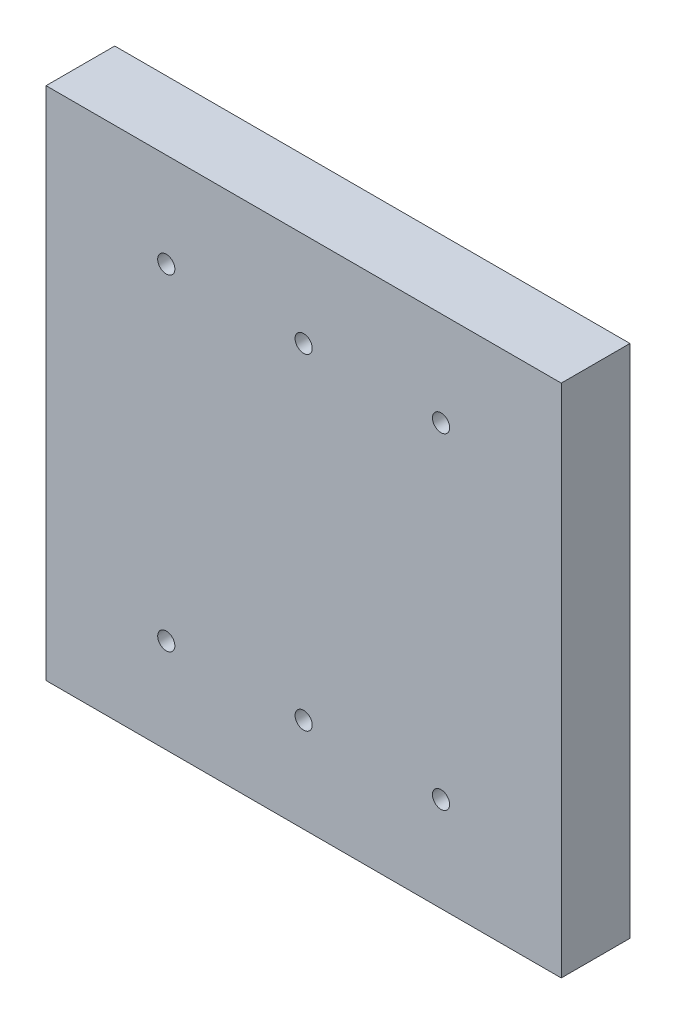
ISO-10303-21;
HEADER;
FILE_DESCRIPTION(('STEP AP214'),'2;1');
FILE_NAME('part.step','',(''),(''),'','','');
FILE_SCHEMA(('AUTOMOTIVE_DESIGN { 1 0 10303 214 1 1 1 1 }'));
ENDSEC;
DATA;
#1=APPLICATION_CONTEXT('core data for automotive mechanical design processes');
#2=APPLICATION_PROTOCOL_DEFINITION('international standard','automotive_design',2000,#1);
#3=PRODUCT_CONTEXT('',#1,'mechanical');
#4=PRODUCT('Part','Part','',(#3));
#5=PRODUCT_RELATED_PRODUCT_CATEGORY('part','',(#4));
#6=PRODUCT_DEFINITION_FORMATION('','',#4);
#7=PRODUCT_DEFINITION_CONTEXT('part definition',#1,'design');
#8=PRODUCT_DEFINITION('design','',#6,#7);
#9=PRODUCT_DEFINITION_SHAPE('','',#8);
#10=(LENGTH_UNIT() NAMED_UNIT(*) SI_UNIT(.MILLI.,.METRE.));
#11=(NAMED_UNIT(*) PLANE_ANGLE_UNIT() SI_UNIT($,.RADIAN.));
#12=(NAMED_UNIT(*) SI_UNIT($,.STERADIAN.) SOLID_ANGLE_UNIT());
#13=UNCERTAINTY_MEASURE_WITH_UNIT(LENGTH_MEASURE(1.E-05),#10,'distance_accuracy_value','');
#14=(GEOMETRIC_REPRESENTATION_CONTEXT(3) GLOBAL_UNCERTAINTY_ASSIGNED_CONTEXT((#13)) GLOBAL_UNIT_ASSIGNED_CONTEXT((#10,
#11,#12)) REPRESENTATION_CONTEXT('',''));
#15=CARTESIAN_POINT('',(0.,0.,0.));
#16=DIRECTION('',(0.,0.,1.));
#17=DIRECTION('',(1.,0.,0.));
#18=AXIS2_PLACEMENT_3D('',#15,#16,#17);
#19=CARTESIAN_POINT('',(-150.,-150.,10.));
#20=DIRECTION('',(0.,1.,0.));
#21=DIRECTION('',(0.,0.,1.));
#22=AXIS2_PLACEMENT_3D('',#19,#20,#21);
#23=PLANE('',#22);
#24=DIRECTION('',(0.,0.,-1.));
#25=VECTOR('',#24,1.);
#26=CARTESIAN_POINT('',(-150.,-150.,10.));
#27=LINE('',#26,#25);
#28=CARTESIAN_POINT('',(-150.,-150.,10.));
#29=VERTEX_POINT('',#28);
#30=CARTESIAN_POINT('',(-150.,-150.,-30.));
#31=VERTEX_POINT('',#30);
#32=EDGE_CURVE('E89',#29,#31,#27,.T.);
#33=ORIENTED_EDGE('',*,*,#32,.T.);
#34=DIRECTION('',(1.,0.,0.));
#35=VECTOR('',#34,1.);
#36=CARTESIAN_POINT('',(0.,-150.,-30.));
#37=LINE('',#36,#35);
#38=CARTESIAN_POINT('',(150.,-150.,-30.));
#39=VERTEX_POINT('',#38);
#40=EDGE_CURVE('E145',#31,#39,#37,.T.);
#41=ORIENTED_EDGE('',*,*,#40,.T.);
#42=DIRECTION('',(0.,0.,-1.));
#43=VECTOR('',#42,1.);
#44=CARTESIAN_POINT('',(150.,-150.,10.));
#45=LINE('',#44,#43);
#46=CARTESIAN_POINT('',(150.,-150.,10.));
#47=VERTEX_POINT('',#46);
#48=EDGE_CURVE('E12',#47,#39,#45,.T.);
#49=ORIENTED_EDGE('',*,*,#48,.F.);
#50=DIRECTION('',(1.,0.,0.));
#51=VECTOR('',#50,1.);
#52=CARTESIAN_POINT('',(-150.,-150.,10.));
#53=LINE('',#52,#51);
#54=EDGE_CURVE('E181',#29,#47,#53,.T.);
#55=ORIENTED_EDGE('',*,*,#54,.F.);
#56=EDGE_LOOP('',(#33,#41,#49,#55));
#57=FACE_BOUND('',#56,.T.);
#58=ADVANCED_FACE('F65',(#57),#23,.F.);
#59=CARTESIAN_POINT('',(150.,-150.,10.));
#60=DIRECTION('',(-1.,0.,0.));
#61=DIRECTION('',(0.,-1.,0.));
#62=AXIS2_PLACEMENT_3D('',#59,#60,#61);
#63=PLANE('',#62);
#64=ORIENTED_EDGE('',*,*,#48,.T.);
#65=DIRECTION('',(0.,1.,0.));
#66=VECTOR('',#65,1.);
#67=CARTESIAN_POINT('',(150.,0.,-30.));
#68=LINE('',#67,#66);
#69=CARTESIAN_POINT('',(150.,150.,-30.));
#70=VERTEX_POINT('',#69);
#71=EDGE_CURVE('E134',#39,#70,#68,.T.);
#72=ORIENTED_EDGE('',*,*,#71,.T.);
#73=DIRECTION('',(0.,0.,-1.));
#74=VECTOR('',#73,1.);
#75=CARTESIAN_POINT('',(150.,150.,10.));
#76=LINE('',#75,#74);
#77=CARTESIAN_POINT('',(150.,150.,10.));
#78=VERTEX_POINT('',#77);
#79=EDGE_CURVE('E73',#78,#70,#76,.T.);
#80=ORIENTED_EDGE('',*,*,#79,.F.);
#81=DIRECTION('',(0.,1.,0.));
#82=VECTOR('',#81,1.);
#83=CARTESIAN_POINT('',(150.,-150.,10.));
#84=LINE('',#83,#82);
#85=EDGE_CURVE('E135',#47,#78,#84,.T.);
#86=ORIENTED_EDGE('',*,*,#85,.F.);
#87=EDGE_LOOP('',(#64,#72,#80,#86));
#88=FACE_BOUND('',#87,.T.);
#89=ADVANCED_FACE('F132',(#88),#63,.F.);
#90=CARTESIAN_POINT('',(-150.,150.,10.));
#91=DIRECTION('',(0.,1.,0.));
#92=DIRECTION('',(0.,0.,1.));
#93=AXIS2_PLACEMENT_3D('',#90,#91,#92);
#94=PLANE('',#93);
#95=ORIENTED_EDGE('',*,*,#79,.T.);
#96=DIRECTION('',(1.,0.,0.));
#97=VECTOR('',#96,1.);
#98=CARTESIAN_POINT('',(0.,150.,-30.));
#99=LINE('',#98,#97);
#100=CARTESIAN_POINT('',(-150.,150.,-30.));
#101=VERTEX_POINT('',#100);
#102=EDGE_CURVE('E147',#101,#70,#99,.T.);
#103=ORIENTED_EDGE('',*,*,#102,.F.);
#104=DIRECTION('',(0.,0.,-1.));
#105=VECTOR('',#104,1.);
#106=CARTESIAN_POINT('',(-150.,150.,10.));
#107=LINE('',#106,#105);
#108=CARTESIAN_POINT('',(-150.,150.,10.));
#109=VERTEX_POINT('',#108);
#110=EDGE_CURVE('E195',#109,#101,#107,.T.);
#111=ORIENTED_EDGE('',*,*,#110,.F.);
#112=DIRECTION('',(1.,0.,0.));
#113=VECTOR('',#112,1.);
#114=CARTESIAN_POINT('',(-150.,150.,10.));
#115=LINE('',#114,#113);
#116=EDGE_CURVE('E189',#109,#78,#115,.T.);
#117=ORIENTED_EDGE('',*,*,#116,.T.);
#118=EDGE_LOOP('',(#95,#103,#111,#117));
#119=FACE_BOUND('',#118,.T.);
#120=ADVANCED_FACE('F235',(#119),#94,.T.);
#121=CARTESIAN_POINT('',(-150.,-150.,10.));
#122=DIRECTION('',(-1.,0.,0.));
#123=DIRECTION('',(0.,0.,1.));
#124=AXIS2_PLACEMENT_3D('',#121,#122,#123);
#125=PLANE('',#124);
#126=ORIENTED_EDGE('',*,*,#110,.T.);
#127=DIRECTION('',(0.,1.,0.));
#128=VECTOR('',#127,1.);
#129=CARTESIAN_POINT('',(-150.,0.,-30.));
#130=LINE('',#129,#128);
#131=EDGE_CURVE('E158',#31,#101,#130,.T.);
#132=ORIENTED_EDGE('',*,*,#131,.F.);
#133=ORIENTED_EDGE('',*,*,#32,.F.);
#134=DIRECTION('',(0.,1.,0.));
#135=VECTOR('',#134,1.);
#136=CARTESIAN_POINT('',(-150.,-150.,10.));
#137=LINE('',#136,#135);
#138=EDGE_CURVE('E192',#29,#109,#137,.T.);
#139=ORIENTED_EDGE('',*,*,#138,.T.);
#140=EDGE_LOOP('',(#126,#132,#133,#139));
#141=FACE_BOUND('',#140,.T.);
#142=ADVANCED_FACE('F239',(#141),#125,.T.);
#143=CARTESIAN_POINT('',(0.,0.,10.));
#144=DIRECTION('',(0.,0.,1.));
#145=DIRECTION('',(1.,0.,0.));
#146=AXIS2_PLACEMENT_3D('',#143,#144,#145);
#147=PLANE('',#146);
#148=CARTESIAN_POINT('',(0.,-94.9999999999998,10.));
#149=DIRECTION('',(0.,0.,1.));
#150=DIRECTION('',(1.,0.,0.));
#151=AXIS2_PLACEMENT_3D('',#148,#149,#150);
#152=CIRCLE('',#151,5.);
#153=CARTESIAN_POINT('',(5.,-94.9999999999998,10.));
#154=VERTEX_POINT('',#153);
#155=EDGE_CURVE('E311',#154,#154,#152,.T.);
#156=ORIENTED_EDGE('',*,*,#155,.F.);
#157=EDGE_LOOP('',(#156));
#158=FACE_BOUND('',#157,.T.);
#159=CARTESIAN_POINT('',(-80.,94.9999999999999,10.));
#160=DIRECTION('',(0.,0.,1.));
#161=DIRECTION('',(1.,0.,0.));
#162=AXIS2_PLACEMENT_3D('',#159,#160,#161);
#163=CIRCLE('',#162,5.00000000000001);
#164=CARTESIAN_POINT('',(-75.,94.9999999999999,10.));
#165=VERTEX_POINT('',#164);
#166=EDGE_CURVE('E309',#165,#165,#163,.T.);
#167=ORIENTED_EDGE('',*,*,#166,.F.);
#168=EDGE_LOOP('',(#167));
#169=FACE_BOUND('',#168,.T.);
#170=CARTESIAN_POINT('',(0.,94.9999999999999,10.));
#171=DIRECTION('',(0.,0.,1.));
#172=DIRECTION('',(1.,0.,0.));
#173=AXIS2_PLACEMENT_3D('',#170,#171,#172);
#174=CIRCLE('',#173,5.);
#175=CARTESIAN_POINT('',(5.00000000000001,94.9999999999999,10.));
#176=VERTEX_POINT('',#175);
#177=EDGE_CURVE('E305',#176,#176,#174,.T.);
#178=ORIENTED_EDGE('',*,*,#177,.F.);
#179=EDGE_LOOP('',(#178));
#180=FACE_BOUND('',#179,.T.);
#181=CARTESIAN_POINT('',(80.,94.9999999999999,10.));
#182=DIRECTION('',(0.,0.,1.));
#183=DIRECTION('',(1.,0.,0.));
#184=AXIS2_PLACEMENT_3D('',#181,#182,#183);
#185=CIRCLE('',#184,5.00000000000001);
#186=CARTESIAN_POINT('',(85.,94.9999999999999,10.));
#187=VERTEX_POINT('',#186);
#188=EDGE_CURVE('E286',#187,#187,#185,.T.);
#189=ORIENTED_EDGE('',*,*,#188,.F.);
#190=EDGE_LOOP('',(#189));
#191=FACE_BOUND('',#190,.T.);
#192=CARTESIAN_POINT('',(-80.,-94.9999999999998,10.));
#193=DIRECTION('',(0.,0.,1.));
#194=DIRECTION('',(1.,0.,0.));
#195=AXIS2_PLACEMENT_3D('',#192,#193,#194);
#196=CIRCLE('',#195,5.00000000000001);
#197=CARTESIAN_POINT('',(-75.,-94.9999999999998,10.));
#198=VERTEX_POINT('',#197);
#199=EDGE_CURVE('E313',#198,#198,#196,.T.);
#200=ORIENTED_EDGE('',*,*,#199,.F.);
#201=EDGE_LOOP('',(#200));
#202=FACE_BOUND('',#201,.T.);
#203=CARTESIAN_POINT('',(80.,-94.9999999999998,10.));
#204=DIRECTION('',(0.,0.,1.));
#205=DIRECTION('',(1.,0.,0.));
#206=AXIS2_PLACEMENT_3D('',#203,#204,#205);
#207=CIRCLE('',#206,5.00000000000001);
#208=CARTESIAN_POINT('',(85.,-94.9999999999998,10.));
#209=VERTEX_POINT('',#208);
#210=EDGE_CURVE('E154',#209,#209,#207,.T.);
#211=ORIENTED_EDGE('',*,*,#210,.F.);
#212=EDGE_LOOP('',(#211));
#213=FACE_BOUND('',#212,.T.);
#214=ORIENTED_EDGE('',*,*,#54,.T.);
#215=ORIENTED_EDGE('',*,*,#85,.T.);
#216=ORIENTED_EDGE('',*,*,#116,.F.);
#217=ORIENTED_EDGE('',*,*,#138,.F.);
#218=EDGE_LOOP('',(#214,#215,#216,#217));
#219=FACE_BOUND('',#218,.T.);
#220=ADVANCED_FACE('F245',(#158,#169,#180,#191,#202,#213,#219),#147,.T.);
#221=CARTESIAN_POINT('',(120.,0.,-30.));
#222=DIRECTION('',(1.,0.,0.));
#223=DIRECTION('',(0.,1.,0.));
#224=AXIS2_PLACEMENT_3D('',#221,#222,#223);
#225=PLANE('',#224);
#226=DIRECTION('',(0.,1.,0.));
#227=VECTOR('',#226,1.);
#228=CARTESIAN_POINT('',(120.,0.,0.));
#229=LINE('',#228,#227);
#230=CARTESIAN_POINT('',(120.,-120.,0.));
#231=VERTEX_POINT('',#230);
#232=CARTESIAN_POINT('',(120.,120.,0.));
#233=VERTEX_POINT('',#232);
#234=EDGE_CURVE('E172',#231,#233,#229,.T.);
#235=ORIENTED_EDGE('',*,*,#234,.T.);
#236=DIRECTION('',(0.,0.,1.));
#237=VECTOR('',#236,1.);
#238=CARTESIAN_POINT('',(120.,120.,-30.));
#239=LINE('',#238,#237);
#240=CARTESIAN_POINT('',(120.,120.,-30.));
#241=VERTEX_POINT('',#240);
#242=EDGE_CURVE('E179',#241,#233,#239,.T.);
#243=ORIENTED_EDGE('',*,*,#242,.F.);
#244=DIRECTION('',(0.,1.,0.));
#245=VECTOR('',#244,1.);
#246=CARTESIAN_POINT('',(120.,0.,-30.));
#247=LINE('',#246,#245);
#248=CARTESIAN_POINT('',(120.,-120.,-30.));
#249=VERTEX_POINT('',#248);
#250=EDGE_CURVE('E160',#249,#241,#247,.T.);
#251=ORIENTED_EDGE('',*,*,#250,.F.);
#252=DIRECTION('',(0.,0.,1.));
#253=VECTOR('',#252,1.);
#254=CARTESIAN_POINT('',(120.,-120.,-30.));
#255=LINE('',#254,#253);
#256=EDGE_CURVE('E171',#249,#231,#255,.T.);
#257=ORIENTED_EDGE('',*,*,#256,.T.);
#258=EDGE_LOOP('',(#235,#243,#251,#257));
#259=FACE_BOUND('',#258,.T.);
#260=ADVANCED_FACE('F251',(#259),#225,.F.);
#261=CARTESIAN_POINT('',(0.,120.,-30.));
#262=DIRECTION('',(0.,1.,0.));
#263=DIRECTION('',(-1.,0.,0.));
#264=AXIS2_PLACEMENT_3D('',#261,#262,#263);
#265=PLANE('',#264);
#266=DIRECTION('',(-1.,0.,0.));
#267=VECTOR('',#266,1.);
#268=CARTESIAN_POINT('',(0.,120.,0.));
#269=LINE('',#268,#267);
#270=CARTESIAN_POINT('',(-120.,120.,0.));
#271=VERTEX_POINT('',#270);
#272=EDGE_CURVE('E149',#233,#271,#269,.T.);
#273=ORIENTED_EDGE('',*,*,#272,.T.);
#274=DIRECTION('',(0.,0.,1.));
#275=VECTOR('',#274,1.);
#276=CARTESIAN_POINT('',(-120.,120.,-30.));
#277=LINE('',#276,#275);
#278=CARTESIAN_POINT('',(-120.,120.,-30.));
#279=VERTEX_POINT('',#278);
#280=EDGE_CURVE('E182',#279,#271,#277,.T.);
#281=ORIENTED_EDGE('',*,*,#280,.F.);
#282=DIRECTION('',(-1.,0.,0.));
#283=VECTOR('',#282,1.);
#284=CARTESIAN_POINT('',(0.,120.,-30.));
#285=LINE('',#284,#283);
#286=EDGE_CURVE('E169',#241,#279,#285,.T.);
#287=ORIENTED_EDGE('',*,*,#286,.F.);
#288=ORIENTED_EDGE('',*,*,#242,.T.);
#289=EDGE_LOOP('',(#273,#281,#287,#288));
#290=FACE_BOUND('',#289,.T.);
#291=ADVANCED_FACE('F255',(#290),#265,.F.);
#292=CARTESIAN_POINT('',(-120.,0.,-30.));
#293=DIRECTION('',(1.,0.,0.));
#294=DIRECTION('',(0.,1.,0.));
#295=AXIS2_PLACEMENT_3D('',#292,#293,#294);
#296=PLANE('',#295);
#297=DIRECTION('',(0.,1.,0.));
#298=VECTOR('',#297,1.);
#299=CARTESIAN_POINT('',(-120.,0.,0.));
#300=LINE('',#299,#298);
#301=CARTESIAN_POINT('',(-120.,-120.,0.));
#302=VERTEX_POINT('',#301);
#303=EDGE_CURVE('E81',#302,#271,#300,.T.);
#304=ORIENTED_EDGE('',*,*,#303,.F.);
#305=DIRECTION('',(0.,0.,1.));
#306=VECTOR('',#305,1.);
#307=CARTESIAN_POINT('',(-120.,-120.,-30.));
#308=LINE('',#307,#306);
#309=CARTESIAN_POINT('',(-120.,-120.,-30.));
#310=VERTEX_POINT('',#309);
#311=EDGE_CURVE('E184',#310,#302,#308,.T.);
#312=ORIENTED_EDGE('',*,*,#311,.F.);
#313=DIRECTION('',(0.,1.,0.));
#314=VECTOR('',#313,1.);
#315=CARTESIAN_POINT('',(-120.,0.,-30.));
#316=LINE('',#315,#314);
#317=EDGE_CURVE('E166',#310,#279,#316,.T.);
#318=ORIENTED_EDGE('',*,*,#317,.T.);
#319=ORIENTED_EDGE('',*,*,#280,.T.);
#320=EDGE_LOOP('',(#304,#312,#318,#319));
#321=FACE_BOUND('',#320,.T.);
#322=ADVANCED_FACE('F260',(#321),#296,.T.);
#323=CARTESIAN_POINT('',(0.,-120.,-30.));
#324=DIRECTION('',(0.,1.,0.));
#325=DIRECTION('',(0.,0.,1.));
#326=AXIS2_PLACEMENT_3D('',#323,#324,#325);
#327=PLANE('',#326);
#328=DIRECTION('',(-1.,0.,0.));
#329=VECTOR('',#328,1.);
#330=CARTESIAN_POINT('',(0.,-120.,0.));
#331=LINE('',#330,#329);
#332=EDGE_CURVE('E175',#231,#302,#331,.T.);
#333=ORIENTED_EDGE('',*,*,#332,.F.);
#334=ORIENTED_EDGE('',*,*,#256,.F.);
#335=DIRECTION('',(-1.,0.,0.));
#336=VECTOR('',#335,1.);
#337=CARTESIAN_POINT('',(0.,-120.,-30.));
#338=LINE('',#337,#336);
#339=EDGE_CURVE('E163',#249,#310,#338,.T.);
#340=ORIENTED_EDGE('',*,*,#339,.T.);
#341=ORIENTED_EDGE('',*,*,#311,.T.);
#342=EDGE_LOOP('',(#333,#334,#340,#341));
#343=FACE_BOUND('',#342,.T.);
#344=ADVANCED_FACE('F257',(#343),#327,.T.);
#345=CARTESIAN_POINT('',(0.,0.,-30.));
#346=DIRECTION('',(0.,0.,1.));
#347=DIRECTION('',(1.,0.,0.));
#348=AXIS2_PLACEMENT_3D('',#345,#346,#347);
#349=PLANE('',#348);
#350=ORIENTED_EDGE('',*,*,#40,.F.);
#351=ORIENTED_EDGE('',*,*,#131,.T.);
#352=ORIENTED_EDGE('',*,*,#102,.T.);
#353=ORIENTED_EDGE('',*,*,#71,.F.);
#354=EDGE_LOOP('',(#350,#351,#352,#353));
#355=FACE_BOUND('',#354,.T.);
#356=ORIENTED_EDGE('',*,*,#250,.T.);
#357=ORIENTED_EDGE('',*,*,#286,.T.);
#358=ORIENTED_EDGE('',*,*,#317,.F.);
#359=ORIENTED_EDGE('',*,*,#339,.F.);
#360=EDGE_LOOP('',(#356,#357,#358,#359));
#361=FACE_BOUND('',#360,.T.);
#362=ADVANCED_FACE('F142',(#355,#361),#349,.F.);
#363=CARTESIAN_POINT('',(0.,0.,0.));
#364=DIRECTION('',(0.,0.,1.));
#365=DIRECTION('',(1.,0.,0.));
#366=AXIS2_PLACEMENT_3D('',#363,#364,#365);
#367=PLANE('',#366);
#368=CARTESIAN_POINT('',(0.,-94.9999999999998,0.));
#369=DIRECTION('',(0.,0.,1.));
#370=DIRECTION('',(1.,0.,0.));
#371=AXIS2_PLACEMENT_3D('',#368,#369,#370);
#372=CIRCLE('',#371,5.);
#373=CARTESIAN_POINT('',(5.,-94.9999999999998,0.));
#374=VERTEX_POINT('',#373);
#375=EDGE_CURVE('E68',#374,#374,#372,.T.);
#376=ORIENTED_EDGE('',*,*,#375,.T.);
#377=EDGE_LOOP('',(#376));
#378=FACE_BOUND('',#377,.T.);
#379=CARTESIAN_POINT('',(-80.,94.9999999999999,0.));
#380=DIRECTION('',(0.,0.,1.));
#381=DIRECTION('',(1.,0.,0.));
#382=AXIS2_PLACEMENT_3D('',#379,#380,#381);
#383=CIRCLE('',#382,5.00000000000001);
#384=CARTESIAN_POINT('',(-75.,94.9999999999999,0.));
#385=VERTEX_POINT('',#384);
#386=EDGE_CURVE('E209',#385,#385,#383,.T.);
#387=ORIENTED_EDGE('',*,*,#386,.T.);
#388=EDGE_LOOP('',(#387));
#389=FACE_BOUND('',#388,.T.);
#390=CARTESIAN_POINT('',(0.,94.9999999999999,0.));
#391=DIRECTION('',(0.,0.,1.));
#392=DIRECTION('',(1.,0.,0.));
#393=AXIS2_PLACEMENT_3D('',#390,#391,#392);
#394=CIRCLE('',#393,5.);
#395=CARTESIAN_POINT('',(5.00000000000001,94.9999999999999,0.));
#396=VERTEX_POINT('',#395);
#397=EDGE_CURVE('E207',#396,#396,#394,.T.);
#398=ORIENTED_EDGE('',*,*,#397,.T.);
#399=EDGE_LOOP('',(#398));
#400=FACE_BOUND('',#399,.T.);
#401=CARTESIAN_POINT('',(80.,94.9999999999999,0.));
#402=DIRECTION('',(0.,0.,1.));
#403=DIRECTION('',(1.,0.,0.));
#404=AXIS2_PLACEMENT_3D('',#401,#402,#403);
#405=CIRCLE('',#404,5.00000000000001);
#406=CARTESIAN_POINT('',(85.,94.9999999999999,0.));
#407=VERTEX_POINT('',#406);
#408=EDGE_CURVE('E204',#407,#407,#405,.T.);
#409=ORIENTED_EDGE('',*,*,#408,.T.);
#410=EDGE_LOOP('',(#409));
#411=FACE_BOUND('',#410,.T.);
#412=CARTESIAN_POINT('',(-80.,-94.9999999999998,0.));
#413=DIRECTION('',(0.,0.,1.));
#414=DIRECTION('',(1.,0.,0.));
#415=AXIS2_PLACEMENT_3D('',#412,#413,#414);
#416=CIRCLE('',#415,5.00000000000001);
#417=CARTESIAN_POINT('',(-75.,-94.9999999999998,0.));
#418=VERTEX_POINT('',#417);
#419=EDGE_CURVE('E201',#418,#418,#416,.T.);
#420=ORIENTED_EDGE('',*,*,#419,.T.);
#421=EDGE_LOOP('',(#420));
#422=FACE_BOUND('',#421,.T.);
#423=CARTESIAN_POINT('',(80.,-94.9999999999998,0.));
#424=DIRECTION('',(0.,0.,1.));
#425=DIRECTION('',(1.,0.,0.));
#426=AXIS2_PLACEMENT_3D('',#423,#424,#425);
#427=CIRCLE('',#426,5.00000000000001);
#428=CARTESIAN_POINT('',(85.,-94.9999999999998,0.));
#429=VERTEX_POINT('',#428);
#430=EDGE_CURVE('E198',#429,#429,#427,.T.);
#431=ORIENTED_EDGE('',*,*,#430,.T.);
#432=EDGE_LOOP('',(#431));
#433=FACE_BOUND('',#432,.T.);
#434=ORIENTED_EDGE('',*,*,#234,.F.);
#435=ORIENTED_EDGE('',*,*,#332,.T.);
#436=ORIENTED_EDGE('',*,*,#303,.T.);
#437=ORIENTED_EDGE('',*,*,#272,.F.);
#438=EDGE_LOOP('',(#434,#435,#436,#437));
#439=FACE_BOUND('',#438,.T.);
#440=ADVANCED_FACE('F216',(#378,#389,#400,#411,#422,#433,#439),#367,.F.);
#441=CARTESIAN_POINT('',(80.,-94.9999999999998,-30.));
#442=DIRECTION('',(0.,0.,1.));
#443=DIRECTION('',(1.,0.,0.));
#444=AXIS2_PLACEMENT_3D('',#441,#442,#443);
#445=CYLINDRICAL_SURFACE('',#444,5.00000000000001);
#446=ORIENTED_EDGE('',*,*,#210,.T.);
#447=EDGE_LOOP('',(#446));
#448=FACE_BOUND('',#447,.T.);
#449=ORIENTED_EDGE('',*,*,#430,.F.);
#450=EDGE_LOOP('',(#449));
#451=FACE_BOUND('',#450,.T.);
#452=ADVANCED_FACE('F248',(#448,#451),#445,.F.);
#453=CARTESIAN_POINT('',(-80.,-94.9999999999998,-30.));
#454=DIRECTION('',(0.,0.,1.));
#455=DIRECTION('',(1.,0.,0.));
#456=AXIS2_PLACEMENT_3D('',#453,#454,#455);
#457=CYLINDRICAL_SURFACE('',#456,5.00000000000001);
#458=ORIENTED_EDGE('',*,*,#199,.T.);
#459=EDGE_LOOP('',(#458));
#460=FACE_BOUND('',#459,.T.);
#461=ORIENTED_EDGE('',*,*,#419,.F.);
#462=EDGE_LOOP('',(#461));
#463=FACE_BOUND('',#462,.T.);
#464=ADVANCED_FACE('F271',(#460,#463),#457,.F.);
#465=CARTESIAN_POINT('',(80.,94.9999999999999,-30.));
#466=DIRECTION('',(0.,0.,1.));
#467=DIRECTION('',(1.,0.,0.));
#468=AXIS2_PLACEMENT_3D('',#465,#466,#467);
#469=CYLINDRICAL_SURFACE('',#468,5.00000000000001);
#470=ORIENTED_EDGE('',*,*,#188,.T.);
#471=EDGE_LOOP('',(#470));
#472=FACE_BOUND('',#471,.T.);
#473=ORIENTED_EDGE('',*,*,#408,.F.);
#474=EDGE_LOOP('',(#473));
#475=FACE_BOUND('',#474,.T.);
#476=ADVANCED_FACE('F274',(#472,#475),#469,.F.);
#477=CARTESIAN_POINT('',(0.,94.9999999999999,-30.));
#478=DIRECTION('',(0.,0.,1.));
#479=DIRECTION('',(1.,0.,0.));
#480=AXIS2_PLACEMENT_3D('',#477,#478,#479);
#481=CYLINDRICAL_SURFACE('',#480,5.);
#482=ORIENTED_EDGE('',*,*,#177,.T.);
#483=EDGE_LOOP('',(#482));
#484=FACE_BOUND('',#483,.T.);
#485=ORIENTED_EDGE('',*,*,#397,.F.);
#486=EDGE_LOOP('',(#485));
#487=FACE_BOUND('',#486,.T.);
#488=ADVANCED_FACE('F226',(#484,#487),#481,.F.);
#489=CARTESIAN_POINT('',(-80.,94.9999999999999,-30.));
#490=DIRECTION('',(0.,0.,1.));
#491=DIRECTION('',(1.,0.,0.));
#492=AXIS2_PLACEMENT_3D('',#489,#490,#491);
#493=CYLINDRICAL_SURFACE('',#492,5.00000000000001);
#494=ORIENTED_EDGE('',*,*,#166,.T.);
#495=EDGE_LOOP('',(#494));
#496=FACE_BOUND('',#495,.T.);
#497=ORIENTED_EDGE('',*,*,#386,.F.);
#498=EDGE_LOOP('',(#497));
#499=FACE_BOUND('',#498,.T.);
#500=ADVANCED_FACE('F220',(#496,#499),#493,.F.);
#501=CARTESIAN_POINT('',(0.,-94.9999999999998,-30.));
#502=DIRECTION('',(0.,0.,1.));
#503=DIRECTION('',(1.,0.,0.));
#504=AXIS2_PLACEMENT_3D('',#501,#502,#503);
#505=CYLINDRICAL_SURFACE('',#504,5.);
#506=ORIENTED_EDGE('',*,*,#155,.T.);
#507=EDGE_LOOP('',(#506));
#508=FACE_BOUND('',#507,.T.);
#509=ORIENTED_EDGE('',*,*,#375,.F.);
#510=EDGE_LOOP('',(#509));
#511=FACE_BOUND('',#510,.T.);
#512=ADVANCED_FACE('F218',(#508,#511),#505,.F.);
#513=CLOSED_SHELL('',(#58,#89,#120,#142,#220,#260,#291,#322,#344,#362,#440,#452,#464,#476,#488,
#500,#512));
#514=MANIFOLD_SOLID_BREP('B2',#513);
#515=ADVANCED_BREP_SHAPE_REPRESENTATION('',(#18,#514),#14);
#516=SHAPE_DEFINITION_REPRESENTATION(#9,#515);
ENDSEC;
END-ISO-10303-21;
